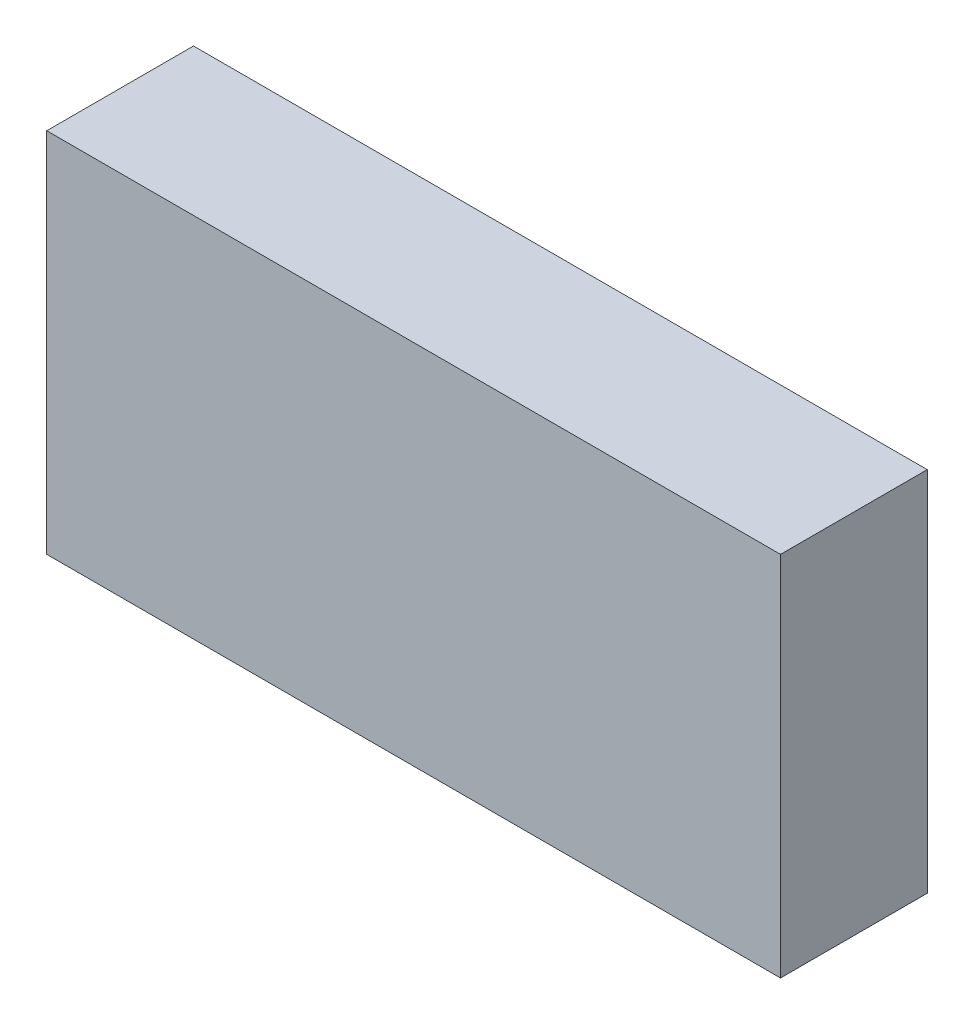
ISO-10303-21;
HEADER;
FILE_DESCRIPTION(('STEP AP214'),'2;1');
FILE_NAME('part.step','',(''),(''),'','','');
FILE_SCHEMA(('AUTOMOTIVE_DESIGN { 1 0 10303 214 1 1 1 1 }'));
ENDSEC;
DATA;
#1=APPLICATION_CONTEXT('core data for automotive mechanical design processes');
#2=APPLICATION_PROTOCOL_DEFINITION('international standard','automotive_design',2000,#1);
#3=PRODUCT_CONTEXT('',#1,'mechanical');
#4=PRODUCT('Part','Part','',(#3));
#5=PRODUCT_RELATED_PRODUCT_CATEGORY('part','',(#4));
#6=PRODUCT_DEFINITION_FORMATION('','',#4);
#7=PRODUCT_DEFINITION_CONTEXT('part definition',#1,'design');
#8=PRODUCT_DEFINITION('design','',#6,#7);
#9=PRODUCT_DEFINITION_SHAPE('','',#8);
#10=(LENGTH_UNIT() NAMED_UNIT(*) SI_UNIT(.MILLI.,.METRE.));
#11=(NAMED_UNIT(*) PLANE_ANGLE_UNIT() SI_UNIT($,.RADIAN.));
#12=(NAMED_UNIT(*) SI_UNIT($,.STERADIAN.) SOLID_ANGLE_UNIT());
#13=UNCERTAINTY_MEASURE_WITH_UNIT(LENGTH_MEASURE(1.E-05),#10,'distance_accuracy_value','');
#14=(GEOMETRIC_REPRESENTATION_CONTEXT(3) GLOBAL_UNCERTAINTY_ASSIGNED_CONTEXT((#13)) GLOBAL_UNIT_ASSIGNED_CONTEXT((#10,
#11,#12)) REPRESENTATION_CONTEXT('',''));
#15=CARTESIAN_POINT('',(0.,0.,0.));
#16=DIRECTION('',(0.,0.,1.));
#17=DIRECTION('',(1.,0.,0.));
#18=AXIS2_PLACEMENT_3D('',#15,#16,#17);
#19=CARTESIAN_POINT('',(-50.,25.,20.));
#20=DIRECTION('',(1.,0.,0.));
#21=DIRECTION('',(0.,1.,0.));
#22=AXIS2_PLACEMENT_3D('',#19,#20,#21);
#23=PLANE('',#22);
#24=DIRECTION('',(0.,-1.,0.));
#25=VECTOR('',#24,1.);
#26=CARTESIAN_POINT('',(-50.,25.,0.));
#27=LINE('',#26,#25);
#28=CARTESIAN_POINT('',(-50.,25.,0.));
#29=VERTEX_POINT('',#28);
#30=CARTESIAN_POINT('',(-50.,-25.,0.));
#31=VERTEX_POINT('',#30);
#32=EDGE_CURVE('E97',#29,#31,#27,.T.);
#33=ORIENTED_EDGE('',*,*,#32,.T.);
#34=DIRECTION('',(0.,0.,-1.));
#35=VECTOR('',#34,1.);
#36=CARTESIAN_POINT('',(-50.,-25.,20.));
#37=LINE('',#36,#35);
#38=CARTESIAN_POINT('',(-50.,-25.,20.));
#39=VERTEX_POINT('',#38);
#40=EDGE_CURVE('E11',#39,#31,#37,.T.);
#41=ORIENTED_EDGE('',*,*,#40,.F.);
#42=DIRECTION('',(0.,-1.,0.));
#43=VECTOR('',#42,1.);
#44=CARTESIAN_POINT('',(-50.,25.,20.));
#45=LINE('',#44,#43);
#46=CARTESIAN_POINT('',(-50.,25.,20.));
#47=VERTEX_POINT('',#46);
#48=EDGE_CURVE('E85',#47,#39,#45,.T.);
#49=ORIENTED_EDGE('',*,*,#48,.F.);
#50=DIRECTION('',(0.,0.,-1.));
#51=VECTOR('',#50,1.);
#52=CARTESIAN_POINT('',(-50.,25.,20.));
#53=LINE('',#52,#51);
#54=EDGE_CURVE('E93',#47,#29,#53,.T.);
#55=ORIENTED_EDGE('',*,*,#54,.T.);
#56=EDGE_LOOP('',(#33,#41,#49,#55));
#57=FACE_BOUND('',#56,.T.);
#58=ADVANCED_FACE('F34',(#57),#23,.F.);
#59=CARTESIAN_POINT('',(-50.,-25.,20.));
#60=DIRECTION('',(0.,1.,0.));
#61=DIRECTION('',(0.,0.,1.));
#62=AXIS2_PLACEMENT_3D('',#59,#60,#61);
#63=PLANE('',#62);
#64=DIRECTION('',(1.,0.,0.));
#65=VECTOR('',#64,1.);
#66=CARTESIAN_POINT('',(-50.,-25.,0.));
#67=LINE('',#66,#65);
#68=CARTESIAN_POINT('',(50.,-25.,0.));
#69=VERTEX_POINT('',#68);
#70=EDGE_CURVE('E89',#31,#69,#67,.T.);
#71=ORIENTED_EDGE('',*,*,#70,.T.);
#72=DIRECTION('',(0.,0.,-1.));
#73=VECTOR('',#72,1.);
#74=CARTESIAN_POINT('',(50.,-25.,20.));
#75=LINE('',#74,#73);
#76=CARTESIAN_POINT('',(50.,-25.,20.));
#77=VERTEX_POINT('',#76);
#78=EDGE_CURVE('E42',#77,#69,#75,.T.);
#79=ORIENTED_EDGE('',*,*,#78,.F.);
#80=DIRECTION('',(1.,0.,0.));
#81=VECTOR('',#80,1.);
#82=CARTESIAN_POINT('',(-50.,-25.,20.));
#83=LINE('',#82,#81);
#84=EDGE_CURVE('E80',#39,#77,#83,.T.);
#85=ORIENTED_EDGE('',*,*,#84,.F.);
#86=ORIENTED_EDGE('',*,*,#40,.T.);
#87=EDGE_LOOP('',(#71,#79,#85,#86));
#88=FACE_BOUND('',#87,.T.);
#89=ADVANCED_FACE('F88',(#88),#63,.F.);
#90=CARTESIAN_POINT('',(50.,25.,20.));
#91=DIRECTION('',(-1.,0.,0.));
#92=DIRECTION('',(0.,-1.,0.));
#93=AXIS2_PLACEMENT_3D('',#90,#91,#92);
#94=PLANE('',#93);
#95=DIRECTION('',(0.,1.,0.));
#96=VECTOR('',#95,1.);
#97=CARTESIAN_POINT('',(50.,25.,0.));
#98=LINE('',#97,#96);
#99=CARTESIAN_POINT('',(50.,25.,0.));
#100=VERTEX_POINT('',#99);
#101=EDGE_CURVE('E67',#69,#100,#98,.T.);
#102=ORIENTED_EDGE('',*,*,#101,.T.);
#103=DIRECTION('',(0.,0.,-1.));
#104=VECTOR('',#103,1.);
#105=CARTESIAN_POINT('',(50.,25.,20.));
#106=LINE('',#105,#104);
#107=CARTESIAN_POINT('',(50.,25.,20.));
#108=VERTEX_POINT('',#107);
#109=EDGE_CURVE('E90',#108,#100,#106,.T.);
#110=ORIENTED_EDGE('',*,*,#109,.F.);
#111=DIRECTION('',(0.,1.,0.));
#112=VECTOR('',#111,1.);
#113=CARTESIAN_POINT('',(50.,25.,20.));
#114=LINE('',#113,#112);
#115=EDGE_CURVE('E83',#77,#108,#114,.T.);
#116=ORIENTED_EDGE('',*,*,#115,.F.);
#117=ORIENTED_EDGE('',*,*,#78,.T.);
#118=EDGE_LOOP('',(#102,#110,#116,#117));
#119=FACE_BOUND('',#118,.T.);
#120=ADVANCED_FACE('F91',(#119),#94,.F.);
#121=CARTESIAN_POINT('',(-50.,25.,20.));
#122=DIRECTION('',(0.,-1.,0.));
#123=DIRECTION('',(0.,0.,-1.));
#124=AXIS2_PLACEMENT_3D('',#121,#122,#123);
#125=PLANE('',#124);
#126=DIRECTION('',(-1.,0.,0.));
#127=VECTOR('',#126,1.);
#128=CARTESIAN_POINT('',(-50.,25.,0.));
#129=LINE('',#128,#127);
#130=EDGE_CURVE('E73',#100,#29,#129,.T.);
#131=ORIENTED_EDGE('',*,*,#130,.T.);
#132=ORIENTED_EDGE('',*,*,#54,.F.);
#133=DIRECTION('',(-1.,0.,0.));
#134=VECTOR('',#133,1.);
#135=CARTESIAN_POINT('',(-50.,25.,20.));
#136=LINE('',#135,#134);
#137=EDGE_CURVE('E50',#108,#47,#136,.T.);
#138=ORIENTED_EDGE('',*,*,#137,.F.);
#139=ORIENTED_EDGE('',*,*,#109,.T.);
#140=EDGE_LOOP('',(#131,#132,#138,#139));
#141=FACE_BOUND('',#140,.T.);
#142=ADVANCED_FACE('F104',(#141),#125,.F.);
#143=CARTESIAN_POINT('',(0.,0.,20.));
#144=DIRECTION('',(0.,0.,1.));
#145=DIRECTION('',(1.,0.,0.));
#146=AXIS2_PLACEMENT_3D('',#143,#144,#145);
#147=PLANE('',#146);
#148=ORIENTED_EDGE('',*,*,#48,.T.);
#149=ORIENTED_EDGE('',*,*,#84,.T.);
#150=ORIENTED_EDGE('',*,*,#115,.T.);
#151=ORIENTED_EDGE('',*,*,#137,.T.);
#152=EDGE_LOOP('',(#148,#149,#150,#151));
#153=FACE_BOUND('',#152,.T.);
#154=ADVANCED_FACE('F81',(#153),#147,.T.);
#155=CARTESIAN_POINT('',(0.,0.,0.));
#156=DIRECTION('',(0.,0.,1.));
#157=DIRECTION('',(1.,0.,0.));
#158=AXIS2_PLACEMENT_3D('',#155,#156,#157);
#159=PLANE('',#158);
#160=ORIENTED_EDGE('',*,*,#32,.F.);
#161=ORIENTED_EDGE('',*,*,#130,.F.);
#162=ORIENTED_EDGE('',*,*,#101,.F.);
#163=ORIENTED_EDGE('',*,*,#70,.F.);
#164=EDGE_LOOP('',(#160,#161,#162,#163));
#165=FACE_BOUND('',#164,.T.);
#166=ADVANCED_FACE('F107',(#165),#159,.F.);
#167=CLOSED_SHELL('',(#58,#89,#120,#142,#154,#166));
#168=MANIFOLD_SOLID_BREP('B2',#167);
#169=ADVANCED_BREP_SHAPE_REPRESENTATION('',(#18,#168),#14);
#170=SHAPE_DEFINITION_REPRESENTATION(#9,#169);
ENDSEC;
END-ISO-10303-21;
